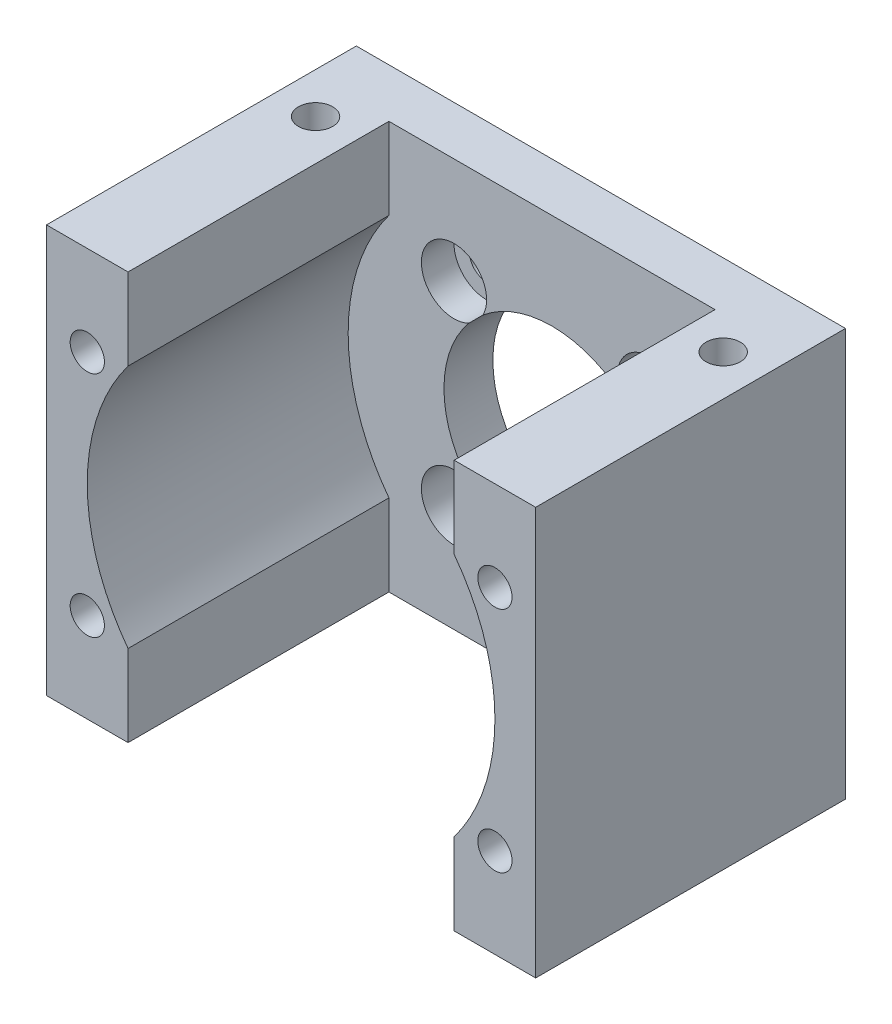
ISO-10303-21;
HEADER;
FILE_DESCRIPTION(('STEP AP214'),'2;1');
FILE_NAME('part.step','',(''),(''),'','','');
FILE_SCHEMA(('AUTOMOTIVE_DESIGN { 1 0 10303 214 1 1 1 1 }'));
ENDSEC;
DATA;
#1=APPLICATION_CONTEXT('core data for automotive mechanical design processes');
#2=APPLICATION_PROTOCOL_DEFINITION('international standard','automotive_design',2000,#1);
#3=PRODUCT_CONTEXT('',#1,'mechanical');
#4=PRODUCT('Part','Part','',(#3));
#5=PRODUCT_RELATED_PRODUCT_CATEGORY('part','',(#4));
#6=PRODUCT_DEFINITION_FORMATION('','',#4);
#7=PRODUCT_DEFINITION_CONTEXT('part definition',#1,'design');
#8=PRODUCT_DEFINITION('design','',#6,#7);
#9=PRODUCT_DEFINITION_SHAPE('','',#8);
#10=(LENGTH_UNIT() NAMED_UNIT(*) SI_UNIT(.MILLI.,.METRE.));
#11=(NAMED_UNIT(*) PLANE_ANGLE_UNIT() SI_UNIT($,.RADIAN.));
#12=(NAMED_UNIT(*) SI_UNIT($,.STERADIAN.) SOLID_ANGLE_UNIT());
#13=UNCERTAINTY_MEASURE_WITH_UNIT(LENGTH_MEASURE(1.E-05),#10,'distance_accuracy_value','');
#14=(GEOMETRIC_REPRESENTATION_CONTEXT(3) GLOBAL_UNCERTAINTY_ASSIGNED_CONTEXT((#13)) GLOBAL_UNIT_ASSIGNED_CONTEXT((#10,
#11,#12)) REPRESENTATION_CONTEXT('',''));
#15=CARTESIAN_POINT('',(0.,0.,0.));
#16=DIRECTION('',(0.,0.,1.));
#17=DIRECTION('',(1.,0.,0.));
#18=AXIS2_PLACEMENT_3D('',#15,#16,#17);
#19=CARTESIAN_POINT('',(-12.0208152801712,12.0208152801714,6.));
#20=DIRECTION('',(0.,0.,1.));
#21=DIRECTION('',(1.,0.,0.));
#22=AXIS2_PLACEMENT_3D('',#19,#20,#21);
#23=CYLINDRICAL_SURFACE('',#22,2.09999999999999);
#24=CARTESIAN_POINT('',(-12.0208152801712,12.0208152801714,0.));
#25=DIRECTION('',(0.,0.,1.));
#26=DIRECTION('',(1.,0.,0.));
#27=AXIS2_PLACEMENT_3D('',#24,#25,#26);
#28=CIRCLE('',#27,2.1);
#29=CARTESIAN_POINT('',(-9.92081528017118,12.0208152801714,0.));
#30=VERTEX_POINT('',#29);
#31=EDGE_CURVE('E333',#30,#30,#28,.T.);
#32=ORIENTED_EDGE('',*,*,#31,.F.);
#33=EDGE_LOOP('',(#32));
#34=FACE_BOUND('',#33,.T.);
#35=CARTESIAN_POINT('',(-12.0208152801712,12.0208152801714,2.));
#36=DIRECTION('',(0.,0.,1.));
#37=DIRECTION('',(1.,0.,0.));
#38=AXIS2_PLACEMENT_3D('',#35,#36,#37);
#39=CIRCLE('',#38,2.09999999999999);
#40=CARTESIAN_POINT('',(-9.92081528017119,12.0208152801714,2.));
#41=VERTEX_POINT('',#40);
#42=EDGE_CURVE('E263',#41,#41,#39,.F.);
#43=ORIENTED_EDGE('',*,*,#42,.F.);
#44=EDGE_LOOP('',(#43));
#45=FACE_BOUND('',#44,.T.);
#46=ADVANCED_FACE('F41',(#34,#45),#23,.F.);
#47=CARTESIAN_POINT('',(-12.0208152801713,-12.0208152801713,6.));
#48=DIRECTION('',(0.,0.,1.));
#49=DIRECTION('',(1.,0.,0.));
#50=AXIS2_PLACEMENT_3D('',#47,#48,#49);
#51=CYLINDRICAL_SURFACE('',#50,2.09999999999999);
#52=CARTESIAN_POINT('',(-12.0208152801713,-12.0208152801713,0.));
#53=DIRECTION('',(0.,0.,1.));
#54=DIRECTION('',(1.,0.,0.));
#55=AXIS2_PLACEMENT_3D('',#52,#53,#54);
#56=CIRCLE('',#55,2.1);
#57=CARTESIAN_POINT('',(-9.92081528017131,-12.0208152801713,0.));
#58=VERTEX_POINT('',#57);
#59=EDGE_CURVE('E336',#58,#58,#56,.T.);
#60=ORIENTED_EDGE('',*,*,#59,.F.);
#61=EDGE_LOOP('',(#60));
#62=FACE_BOUND('',#61,.T.);
#63=CARTESIAN_POINT('',(-12.0208152801713,-12.0208152801713,2.));
#64=DIRECTION('',(0.,0.,1.));
#65=DIRECTION('',(1.,0.,0.));
#66=AXIS2_PLACEMENT_3D('',#63,#64,#65);
#67=CIRCLE('',#66,2.09999999999999);
#68=CARTESIAN_POINT('',(-9.92081528017132,-12.0208152801713,2.));
#69=VERTEX_POINT('',#68);
#70=EDGE_CURVE('E256',#69,#69,#67,.F.);
#71=ORIENTED_EDGE('',*,*,#70,.F.);
#72=EDGE_LOOP('',(#71));
#73=FACE_BOUND('',#72,.T.);
#74=ADVANCED_FACE('F486',(#62,#73),#51,.F.);
#75=CARTESIAN_POINT('',(12.0208152801713,-12.0208152801713,6.));
#76=DIRECTION('',(0.,0.,1.));
#77=DIRECTION('',(1.,0.,0.));
#78=AXIS2_PLACEMENT_3D('',#75,#76,#77);
#79=CYLINDRICAL_SURFACE('',#78,2.09999999999999);
#80=CARTESIAN_POINT('',(12.0208152801713,-12.0208152801713,0.));
#81=DIRECTION('',(0.,0.,1.));
#82=DIRECTION('',(1.,0.,0.));
#83=AXIS2_PLACEMENT_3D('',#80,#81,#82);
#84=CIRCLE('',#83,2.1);
#85=CARTESIAN_POINT('',(14.1208152801713,-12.0208152801713,0.));
#86=VERTEX_POINT('',#85);
#87=EDGE_CURVE('E339',#86,#86,#84,.T.);
#88=ORIENTED_EDGE('',*,*,#87,.F.);
#89=EDGE_LOOP('',(#88));
#90=FACE_BOUND('',#89,.T.);
#91=CARTESIAN_POINT('',(12.0208152801713,-12.0208152801713,2.));
#92=DIRECTION('',(0.,0.,1.));
#93=DIRECTION('',(1.,0.,0.));
#94=AXIS2_PLACEMENT_3D('',#91,#92,#93);
#95=CIRCLE('',#94,2.09999999999999);
#96=CARTESIAN_POINT('',(14.1208152801712,-12.0208152801713,2.));
#97=VERTEX_POINT('',#96);
#98=EDGE_CURVE('E245',#97,#97,#95,.F.);
#99=ORIENTED_EDGE('',*,*,#98,.F.);
#100=EDGE_LOOP('',(#99));
#101=FACE_BOUND('',#100,.T.);
#102=ADVANCED_FACE('F492',(#90,#101),#79,.F.);
#103=CARTESIAN_POINT('',(12.0208152801713,12.0208152801713,6.));
#104=DIRECTION('',(0.,0.,1.));
#105=DIRECTION('',(1.,0.,0.));
#106=AXIS2_PLACEMENT_3D('',#103,#104,#105);
#107=CYLINDRICAL_SURFACE('',#106,2.09999999999999);
#108=CARTESIAN_POINT('',(12.0208152801713,12.0208152801713,0.));
#109=DIRECTION('',(0.,0.,1.));
#110=DIRECTION('',(1.,0.,0.));
#111=AXIS2_PLACEMENT_3D('',#108,#109,#110);
#112=CIRCLE('',#111,2.1);
#113=CARTESIAN_POINT('',(14.1208152801713,12.0208152801713,0.));
#114=VERTEX_POINT('',#113);
#115=EDGE_CURVE('E330',#114,#114,#112,.T.);
#116=ORIENTED_EDGE('',*,*,#115,.F.);
#117=EDGE_LOOP('',(#116));
#118=FACE_BOUND('',#117,.T.);
#119=CARTESIAN_POINT('',(12.0208152801713,12.0208152801713,2.));
#120=DIRECTION('',(0.,0.,1.));
#121=DIRECTION('',(1.,0.,0.));
#122=AXIS2_PLACEMENT_3D('',#119,#120,#121);
#123=CIRCLE('',#122,2.09999999999999);
#124=CARTESIAN_POINT('',(14.1208152801713,12.0208152801713,2.));
#125=VERTEX_POINT('',#124);
#126=EDGE_CURVE('E233',#125,#125,#123,.F.);
#127=ORIENTED_EDGE('',*,*,#126,.F.);
#128=EDGE_LOOP('',(#127));
#129=FACE_BOUND('',#128,.T.);
#130=ADVANCED_FACE('F498',(#118,#129),#107,.F.);
#131=CARTESIAN_POINT('',(20.,-25.,6.));
#132=DIRECTION('',(1.,0.,0.));
#133=DIRECTION('',(0.,0.,-1.));
#134=AXIS2_PLACEMENT_3D('',#131,#132,#133);
#135=PLANE('',#134);
#136=DIRECTION('',(0.,1.,0.));
#137=VECTOR('',#136,1.);
#138=CARTESIAN_POINT('',(20.,-25.,6.));
#139=LINE('',#138,#137);
#140=CARTESIAN_POINT('',(20.,15.,5.99999999999999));
#141=VERTEX_POINT('',#140);
#142=CARTESIAN_POINT('',(20.,25.,6.));
#143=VERTEX_POINT('',#142);
#144=EDGE_CURVE('E372',#141,#143,#139,.T.);
#145=ORIENTED_EDGE('',*,*,#144,.F.);
#146=DIRECTION('',(0.,0.,1.));
#147=VECTOR('',#146,1.);
#148=CARTESIAN_POINT('',(20.,15.,-64.7106781186548));
#149=LINE('',#148,#147);
#150=CARTESIAN_POINT('',(20.,15.,38.));
#151=VERTEX_POINT('',#150);
#152=EDGE_CURVE('E359',#141,#151,#149,.T.);
#153=ORIENTED_EDGE('',*,*,#152,.T.);
#154=DIRECTION('',(0.,1.,0.));
#155=VECTOR('',#154,1.);
#156=CARTESIAN_POINT('',(20.,0.,38.));
#157=LINE('',#156,#155);
#158=CARTESIAN_POINT('',(20.,25.,38.));
#159=VERTEX_POINT('',#158);
#160=EDGE_CURVE('E421',#151,#159,#157,.T.);
#161=ORIENTED_EDGE('',*,*,#160,.T.);
#162=DIRECTION('',(0.,0.,-1.));
#163=VECTOR('',#162,1.);
#164=CARTESIAN_POINT('',(20.,25.,6.));
#165=LINE('',#164,#163);
#166=EDGE_CURVE('E362',#159,#143,#165,.T.);
#167=ORIENTED_EDGE('',*,*,#166,.T.);
#168=EDGE_LOOP('',(#145,#153,#161,#167));
#169=FACE_BOUND('',#168,.T.);
#170=ADVANCED_FACE('F473',(#169),#135,.F.);
#171=CARTESIAN_POINT('',(-20.,-25.,5.99999999999999));
#172=DIRECTION('',(-1.,0.,0.));
#173=DIRECTION('',(0.,0.,1.));
#174=AXIS2_PLACEMENT_3D('',#171,#172,#173);
#175=PLANE('',#174);
#176=DIRECTION('',(0.,1.,0.));
#177=VECTOR('',#176,1.);
#178=CARTESIAN_POINT('',(-20.,-25.,5.99999999999999));
#179=LINE('',#178,#177);
#180=CARTESIAN_POINT('',(-20.,-25.,5.99999999999999));
#181=VERTEX_POINT('',#180);
#182=CARTESIAN_POINT('',(-20.,-15.,5.99999999999999));
#183=VERTEX_POINT('',#182);
#184=EDGE_CURVE('E378',#181,#183,#179,.T.);
#185=ORIENTED_EDGE('',*,*,#184,.T.);
#186=DIRECTION('',(0.,0.,1.));
#187=VECTOR('',#186,1.);
#188=CARTESIAN_POINT('',(-20.,-15.,-64.7106781186548));
#189=LINE('',#188,#187);
#190=CARTESIAN_POINT('',(-20.,-15.,38.));
#191=VERTEX_POINT('',#190);
#192=EDGE_CURVE('E353',#183,#191,#189,.T.);
#193=ORIENTED_EDGE('',*,*,#192,.T.);
#194=DIRECTION('',(0.,-1.,0.));
#195=VECTOR('',#194,1.);
#196=CARTESIAN_POINT('',(-20.,0.,38.));
#197=LINE('',#196,#195);
#198=CARTESIAN_POINT('',(-20.,-25.,38.));
#199=VERTEX_POINT('',#198);
#200=EDGE_CURVE('E418',#191,#199,#197,.T.);
#201=ORIENTED_EDGE('',*,*,#200,.T.);
#202=DIRECTION('',(0.,0.,1.));
#203=VECTOR('',#202,1.);
#204=CARTESIAN_POINT('',(-20.,-25.,5.99999999999999));
#205=LINE('',#204,#203);
#206=EDGE_CURVE('E369',#181,#199,#205,.T.);
#207=ORIENTED_EDGE('',*,*,#206,.F.);
#208=EDGE_LOOP('',(#185,#193,#201,#207));
#209=FACE_BOUND('',#208,.T.);
#210=ADVANCED_FACE('F427',(#209),#175,.F.);
#211=CARTESIAN_POINT('',(0.,0.,38.));
#212=DIRECTION('',(0.,0.,1.));
#213=DIRECTION('',(1.,0.,0.));
#214=AXIS2_PLACEMENT_3D('',#211,#212,#213);
#215=PLANE('',#214);
#216=CARTESIAN_POINT('',(25.,-14.,38.));
#217=DIRECTION('',(0.,0.,1.));
#218=DIRECTION('',(1.,0.,0.));
#219=AXIS2_PLACEMENT_3D('',#216,#217,#218);
#220=CIRCLE('',#219,2.09999999999999);
#221=CARTESIAN_POINT('',(27.1,-14.,38.));
#222=VERTEX_POINT('',#221);
#223=EDGE_CURVE('E318',#222,#222,#220,.T.);
#224=ORIENTED_EDGE('',*,*,#223,.F.);
#225=EDGE_LOOP('',(#224));
#226=FACE_BOUND('',#225,.T.);
#227=CARTESIAN_POINT('',(25.,14.,38.));
#228=DIRECTION('',(0.,0.,1.));
#229=DIRECTION('',(1.,0.,0.));
#230=AXIS2_PLACEMENT_3D('',#227,#228,#229);
#231=CIRCLE('',#230,2.09999999999999);
#232=CARTESIAN_POINT('',(27.1,14.,38.));
#233=VERTEX_POINT('',#232);
#234=EDGE_CURVE('E324',#233,#233,#231,.T.);
#235=ORIENTED_EDGE('',*,*,#234,.F.);
#236=EDGE_LOOP('',(#235));
#237=FACE_BOUND('',#236,.T.);
#238=CARTESIAN_POINT('',(0.,0.,38.));
#239=DIRECTION('',(0.,0.,1.));
#240=DIRECTION('',(1.,0.,0.));
#241=AXIS2_PLACEMENT_3D('',#238,#239,#240);
#242=CIRCLE('',#241,25.);
#243=CARTESIAN_POINT('',(20.,-15.,38.));
#244=VERTEX_POINT('',#243);
#245=EDGE_CURVE('E230',#244,#151,#242,.T.);
#246=ORIENTED_EDGE('',*,*,#245,.F.);
#247=CARTESIAN_POINT('',(20.,-25.,38.));
#248=VERTEX_POINT('',#247);
#249=EDGE_CURVE('E231',#248,#244,#157,.T.);
#250=ORIENTED_EDGE('',*,*,#249,.F.);
#251=DIRECTION('',(1.,0.,0.));
#252=VECTOR('',#251,1.);
#253=CARTESIAN_POINT('',(-30.,-25.,38.));
#254=LINE('',#253,#252);
#255=CARTESIAN_POINT('',(30.,-25.,38.));
#256=VERTEX_POINT('',#255);
#257=EDGE_CURVE('E396',#248,#256,#254,.T.);
#258=ORIENTED_EDGE('',*,*,#257,.T.);
#259=DIRECTION('',(0.,1.,0.));
#260=VECTOR('',#259,1.);
#261=CARTESIAN_POINT('',(30.,25.,38.));
#262=LINE('',#261,#260);
#263=CARTESIAN_POINT('',(30.,25.,38.));
#264=VERTEX_POINT('',#263);
#265=EDGE_CURVE('E386',#256,#264,#262,.T.);
#266=ORIENTED_EDGE('',*,*,#265,.T.);
#267=DIRECTION('',(-1.,0.,0.));
#268=VECTOR('',#267,1.);
#269=CARTESIAN_POINT('',(-30.,25.,38.));
#270=LINE('',#269,#268);
#271=EDGE_CURVE('E391',#264,#159,#270,.T.);
#272=ORIENTED_EDGE('',*,*,#271,.T.);
#273=ORIENTED_EDGE('',*,*,#160,.F.);
#274=EDGE_LOOP('',(#246,#250,#258,#266,#272,#273));
#275=FACE_BOUND('',#274,.T.);
#276=ADVANCED_FACE('F455',(#226,#237,#275),#215,.T.);
#277=CARTESIAN_POINT('',(30.,25.,38.));
#278=DIRECTION('',(-1.,0.,0.));
#279=DIRECTION('',(0.,-1.,0.));
#280=AXIS2_PLACEMENT_3D('',#277,#278,#279);
#281=PLANE('',#280);
#282=DIRECTION('',(0.,1.,0.));
#283=VECTOR('',#282,1.);
#284=CARTESIAN_POINT('',(30.,25.,0.));
#285=LINE('',#284,#283);
#286=CARTESIAN_POINT('',(30.,-25.,0.));
#287=VERTEX_POINT('',#286);
#288=CARTESIAN_POINT('',(30.,25.,0.));
#289=VERTEX_POINT('',#288);
#290=EDGE_CURVE('E381',#287,#289,#285,.T.);
#291=ORIENTED_EDGE('',*,*,#290,.T.);
#292=DIRECTION('',(0.,0.,-1.));
#293=VECTOR('',#292,1.);
#294=CARTESIAN_POINT('',(30.,25.,38.));
#295=LINE('',#294,#293);
#296=EDGE_CURVE('E416',#264,#289,#295,.T.);
#297=ORIENTED_EDGE('',*,*,#296,.F.);
#298=ORIENTED_EDGE('',*,*,#265,.F.);
#299=DIRECTION('',(0.,0.,-1.));
#300=VECTOR('',#299,1.);
#301=CARTESIAN_POINT('',(30.,-25.,38.));
#302=LINE('',#301,#300);
#303=EDGE_CURVE('E400',#256,#287,#302,.T.);
#304=ORIENTED_EDGE('',*,*,#303,.T.);
#305=EDGE_LOOP('',(#291,#297,#298,#304));
#306=FACE_BOUND('',#305,.T.);
#307=ADVANCED_FACE('F43',(#306),#281,.F.);
#308=CARTESIAN_POINT('',(-30.,25.,38.));
#309=DIRECTION('',(0.,-1.,0.));
#310=DIRECTION('',(0.,0.,-1.));
#311=AXIS2_PLACEMENT_3D('',#308,#309,#310);
#312=PLANE('',#311);
#313=CARTESIAN_POINT('',(-25.,25.,10.));
#314=DIRECTION('',(0.,1.,0.));
#315=DIRECTION('',(0.,0.,1.));
#316=AXIS2_PLACEMENT_3D('',#313,#314,#315);
#317=CIRCLE('',#316,2.1);
#318=CARTESIAN_POINT('',(-25.,25.,12.1));
#319=VERTEX_POINT('',#318);
#320=EDGE_CURVE('E294',#319,#319,#317,.T.);
#321=ORIENTED_EDGE('',*,*,#320,.F.);
#322=EDGE_LOOP('',(#321));
#323=FACE_BOUND('',#322,.T.);
#324=CARTESIAN_POINT('',(25.,25.,10.));
#325=DIRECTION('',(0.,1.,0.));
#326=DIRECTION('',(0.,0.,1.));
#327=AXIS2_PLACEMENT_3D('',#324,#325,#326);
#328=CIRCLE('',#327,2.1);
#329=CARTESIAN_POINT('',(25.,25.,12.1));
#330=VERTEX_POINT('',#329);
#331=EDGE_CURVE('E300',#330,#330,#328,.T.);
#332=ORIENTED_EDGE('',*,*,#331,.F.);
#333=EDGE_LOOP('',(#332));
#334=FACE_BOUND('',#333,.T.);
#335=DIRECTION('',(-1.,0.,0.));
#336=VECTOR('',#335,1.);
#337=CARTESIAN_POINT('',(-20.,25.,5.99999999999999));
#338=LINE('',#337,#336);
#339=CARTESIAN_POINT('',(-20.,25.,5.99999999999999));
#340=VERTEX_POINT('',#339);
#341=EDGE_CURVE('E375',#143,#340,#338,.T.);
#342=ORIENTED_EDGE('',*,*,#341,.F.);
#343=ORIENTED_EDGE('',*,*,#166,.F.);
#344=ORIENTED_EDGE('',*,*,#271,.F.);
#345=ORIENTED_EDGE('',*,*,#296,.T.);
#346=DIRECTION('',(-1.,0.,0.));
#347=VECTOR('',#346,1.);
#348=CARTESIAN_POINT('',(-30.,25.,0.));
#349=LINE('',#348,#347);
#350=CARTESIAN_POINT('',(-30.,25.,0.));
#351=VERTEX_POINT('',#350);
#352=EDGE_CURVE('E403',#289,#351,#349,.T.);
#353=ORIENTED_EDGE('',*,*,#352,.T.);
#354=DIRECTION('',(0.,0.,-1.));
#355=VECTOR('',#354,1.);
#356=CARTESIAN_POINT('',(-30.,25.,38.));
#357=LINE('',#356,#355);
#358=CARTESIAN_POINT('',(-30.,25.,38.));
#359=VERTEX_POINT('',#358);
#360=EDGE_CURVE('E413',#359,#351,#357,.T.);
#361=ORIENTED_EDGE('',*,*,#360,.F.);
#362=CARTESIAN_POINT('',(-20.,25.,38.));
#363=VERTEX_POINT('',#362);
#364=EDGE_CURVE('E389',#363,#359,#270,.T.);
#365=ORIENTED_EDGE('',*,*,#364,.F.);
#366=DIRECTION('',(0.,0.,1.));
#367=VECTOR('',#366,1.);
#368=CARTESIAN_POINT('',(-20.,25.,5.99999999999999));
#369=LINE('',#368,#367);
#370=EDGE_CURVE('E367',#340,#363,#369,.T.);
#371=ORIENTED_EDGE('',*,*,#370,.F.);
#372=EDGE_LOOP('',(#342,#343,#344,#345,#353,#361,#365,#371));
#373=FACE_BOUND('',#372,.T.);
#374=ADVANCED_FACE('F469',(#323,#334,#373),#312,.F.);
#375=CARTESIAN_POINT('',(-30.,25.,38.));
#376=DIRECTION('',(1.,0.,0.));
#377=DIRECTION('',(0.,1.,0.));
#378=AXIS2_PLACEMENT_3D('',#375,#376,#377);
#379=PLANE('',#378);
#380=DIRECTION('',(0.,-1.,0.));
#381=VECTOR('',#380,1.);
#382=CARTESIAN_POINT('',(-30.,25.,0.));
#383=LINE('',#382,#381);
#384=CARTESIAN_POINT('',(-30.,-25.,0.));
#385=VERTEX_POINT('',#384);
#386=EDGE_CURVE('E405',#351,#385,#383,.T.);
#387=ORIENTED_EDGE('',*,*,#386,.T.);
#388=DIRECTION('',(0.,0.,-1.));
#389=VECTOR('',#388,1.);
#390=CARTESIAN_POINT('',(-30.,-25.,38.));
#391=LINE('',#390,#389);
#392=CARTESIAN_POINT('',(-30.,-25.,38.));
#393=VERTEX_POINT('',#392);
#394=EDGE_CURVE('E410',#393,#385,#391,.T.);
#395=ORIENTED_EDGE('',*,*,#394,.F.);
#396=DIRECTION('',(0.,-1.,0.));
#397=VECTOR('',#396,1.);
#398=CARTESIAN_POINT('',(-30.,25.,38.));
#399=LINE('',#398,#397);
#400=EDGE_CURVE('E394',#359,#393,#399,.T.);
#401=ORIENTED_EDGE('',*,*,#400,.F.);
#402=ORIENTED_EDGE('',*,*,#360,.T.);
#403=EDGE_LOOP('',(#387,#395,#401,#402));
#404=FACE_BOUND('',#403,.T.);
#405=ADVANCED_FACE('F442',(#404),#379,.F.);
#406=CARTESIAN_POINT('',(-30.,-25.,38.));
#407=DIRECTION('',(0.,1.,0.));
#408=DIRECTION('',(0.,0.,1.));
#409=AXIS2_PLACEMENT_3D('',#406,#407,#408);
#410=PLANE('',#409);
#411=CARTESIAN_POINT('',(-25.,-25.,10.));
#412=DIRECTION('',(0.,-1.,0.));
#413=DIRECTION('',(0.,0.,-1.));
#414=AXIS2_PLACEMENT_3D('',#411,#412,#413);
#415=CIRCLE('',#414,2.1);
#416=CARTESIAN_POINT('',(-25.,-25.,7.9));
#417=VERTEX_POINT('',#416);
#418=EDGE_CURVE('E282',#417,#417,#415,.T.);
#419=ORIENTED_EDGE('',*,*,#418,.F.);
#420=EDGE_LOOP('',(#419));
#421=FACE_BOUND('',#420,.T.);
#422=CARTESIAN_POINT('',(25.,-25.,10.));
#423=DIRECTION('',(0.,-1.,0.));
#424=DIRECTION('',(0.,0.,-1.));
#425=AXIS2_PLACEMENT_3D('',#422,#423,#424);
#426=CIRCLE('',#425,2.1);
#427=CARTESIAN_POINT('',(25.,-25.,7.9));
#428=VERTEX_POINT('',#427);
#429=EDGE_CURVE('E288',#428,#428,#426,.T.);
#430=ORIENTED_EDGE('',*,*,#429,.F.);
#431=EDGE_LOOP('',(#430));
#432=FACE_BOUND('',#431,.T.);
#433=ORIENTED_EDGE('',*,*,#257,.F.);
#434=DIRECTION('',(0.,0.,-1.));
#435=VECTOR('',#434,1.);
#436=CARTESIAN_POINT('',(20.,-25.,6.));
#437=LINE('',#436,#435);
#438=CARTESIAN_POINT('',(20.,-25.,6.));
#439=VERTEX_POINT('',#438);
#440=EDGE_CURVE('E363',#248,#439,#437,.T.);
#441=ORIENTED_EDGE('',*,*,#440,.T.);
#442=DIRECTION('',(-1.,0.,0.));
#443=VECTOR('',#442,1.);
#444=CARTESIAN_POINT('',(-20.,-25.,5.99999999999999));
#445=LINE('',#444,#443);
#446=EDGE_CURVE('E366',#439,#181,#445,.T.);
#447=ORIENTED_EDGE('',*,*,#446,.T.);
#448=ORIENTED_EDGE('',*,*,#206,.T.);
#449=EDGE_CURVE('E397',#393,#199,#254,.T.);
#450=ORIENTED_EDGE('',*,*,#449,.F.);
#451=ORIENTED_EDGE('',*,*,#394,.T.);
#452=DIRECTION('',(1.,0.,0.));
#453=VECTOR('',#452,1.);
#454=CARTESIAN_POINT('',(-30.,-25.,0.));
#455=LINE('',#454,#453);
#456=EDGE_CURVE('E390',#385,#287,#455,.T.);
#457=ORIENTED_EDGE('',*,*,#456,.T.);
#458=ORIENTED_EDGE('',*,*,#303,.F.);
#459=EDGE_LOOP('',(#433,#441,#447,#448,#450,#451,#457,#458));
#460=FACE_BOUND('',#459,.T.);
#461=ADVANCED_FACE('F433',(#421,#432,#460),#410,.F.);
#462=CARTESIAN_POINT('',(-25.,14.,38.));
#463=DIRECTION('',(0.,0.,1.));
#464=DIRECTION('',(1.,0.,0.));
#465=AXIS2_PLACEMENT_3D('',#462,#463,#464);
#466=CIRCLE('',#465,2.09999999999999);
#467=CARTESIAN_POINT('',(-22.9,14.,38.));
#468=VERTEX_POINT('',#467);
#469=EDGE_CURVE('E306',#468,#468,#466,.T.);
#470=ORIENTED_EDGE('',*,*,#469,.F.);
#471=EDGE_LOOP('',(#470));
#472=FACE_BOUND('',#471,.T.);
#473=CARTESIAN_POINT('',(-25.,-14.,38.));
#474=DIRECTION('',(0.,0.,1.));
#475=DIRECTION('',(1.,0.,0.));
#476=AXIS2_PLACEMENT_3D('',#473,#474,#475);
#477=CIRCLE('',#476,2.09999999999999);
#478=CARTESIAN_POINT('',(-22.9,-14.,38.));
#479=VERTEX_POINT('',#478);
#480=EDGE_CURVE('E312',#479,#479,#477,.T.);
#481=ORIENTED_EDGE('',*,*,#480,.F.);
#482=EDGE_LOOP('',(#481));
#483=FACE_BOUND('',#482,.T.);
#484=CARTESIAN_POINT('',(-20.,15.,38.));
#485=VERTEX_POINT('',#484);
#486=EDGE_CURVE('E345',#485,#191,#242,.T.);
#487=ORIENTED_EDGE('',*,*,#486,.F.);
#488=EDGE_CURVE('E419',#363,#485,#197,.T.);
#489=ORIENTED_EDGE('',*,*,#488,.F.);
#490=ORIENTED_EDGE('',*,*,#364,.T.);
#491=ORIENTED_EDGE('',*,*,#400,.T.);
#492=ORIENTED_EDGE('',*,*,#449,.T.);
#493=ORIENTED_EDGE('',*,*,#200,.F.);
#494=EDGE_LOOP('',(#487,#489,#490,#491,#492,#493));
#495=FACE_BOUND('',#494,.T.);
#496=ADVANCED_FACE('F436',(#472,#483,#495),#215,.T.);
#497=CARTESIAN_POINT('',(0.,0.,0.));
#498=DIRECTION('',(0.,0.,1.));
#499=DIRECTION('',(1.,0.,0.));
#500=AXIS2_PLACEMENT_3D('',#497,#498,#499);
#501=PLANE('',#500);
#502=ORIENTED_EDGE('',*,*,#115,.T.);
#503=EDGE_LOOP('',(#502));
#504=FACE_BOUND('',#503,.T.);
#505=ORIENTED_EDGE('',*,*,#31,.T.);
#506=EDGE_LOOP('',(#505));
#507=FACE_BOUND('',#506,.T.);
#508=ORIENTED_EDGE('',*,*,#59,.T.);
#509=EDGE_LOOP('',(#508));
#510=FACE_BOUND('',#509,.T.);
#511=ORIENTED_EDGE('',*,*,#87,.T.);
#512=EDGE_LOOP('',(#511));
#513=FACE_BOUND('',#512,.T.);
#514=CARTESIAN_POINT('',(0.,0.,0.));
#515=DIRECTION('',(0.,0.,-1.));
#516=DIRECTION('',(-1.,0.,0.));
#517=AXIS2_PLACEMENT_3D('',#514,#515,#516);
#518=CIRCLE('',#517,13.25);
#519=CARTESIAN_POINT('',(-13.25,0.,0.));
#520=VERTEX_POINT('',#519);
#521=EDGE_CURVE('E226',#520,#520,#518,.T.);
#522=ORIENTED_EDGE('',*,*,#521,.F.);
#523=EDGE_LOOP('',(#522));
#524=FACE_BOUND('',#523,.T.);
#525=ORIENTED_EDGE('',*,*,#290,.F.);
#526=ORIENTED_EDGE('',*,*,#456,.F.);
#527=ORIENTED_EDGE('',*,*,#386,.F.);
#528=ORIENTED_EDGE('',*,*,#352,.F.);
#529=EDGE_LOOP('',(#525,#526,#527,#528));
#530=FACE_BOUND('',#529,.T.);
#531=ADVANCED_FACE('F448',(#504,#507,#510,#513,#524,#530),#501,.F.);
#532=ORIENTED_EDGE('',*,*,#249,.T.);
#533=DIRECTION('',(0.,0.,1.));
#534=VECTOR('',#533,1.);
#535=CARTESIAN_POINT('',(20.,-15.,-64.7106781186548));
#536=LINE('',#535,#534);
#537=CARTESIAN_POINT('',(20.,-15.,5.99999999999999));
#538=VERTEX_POINT('',#537);
#539=EDGE_CURVE('E356',#244,#538,#536,.F.);
#540=ORIENTED_EDGE('',*,*,#539,.T.);
#541=EDGE_CURVE('E383',#439,#538,#139,.T.);
#542=ORIENTED_EDGE('',*,*,#541,.F.);
#543=ORIENTED_EDGE('',*,*,#440,.F.);
#544=EDGE_LOOP('',(#532,#540,#542,#543));
#545=FACE_BOUND('',#544,.T.);
#546=ADVANCED_FACE('F459',(#545),#135,.F.);
#547=ORIENTED_EDGE('',*,*,#488,.T.);
#548=DIRECTION('',(0.,0.,1.));
#549=VECTOR('',#548,1.);
#550=CARTESIAN_POINT('',(-20.,15.,-64.7106781186548));
#551=LINE('',#550,#549);
#552=CARTESIAN_POINT('',(-20.,15.,5.99999999999999));
#553=VERTEX_POINT('',#552);
#554=EDGE_CURVE('E350',#485,#553,#551,.F.);
#555=ORIENTED_EDGE('',*,*,#554,.T.);
#556=EDGE_CURVE('E382',#553,#340,#179,.T.);
#557=ORIENTED_EDGE('',*,*,#556,.T.);
#558=ORIENTED_EDGE('',*,*,#370,.T.);
#559=EDGE_LOOP('',(#547,#555,#557,#558));
#560=FACE_BOUND('',#559,.T.);
#561=ADVANCED_FACE('F465',(#560),#175,.F.);
#562=CARTESIAN_POINT('',(-20.,-25.,5.99999999999999));
#563=DIRECTION('',(0.,0.,-1.));
#564=DIRECTION('',(-1.,0.,0.));
#565=AXIS2_PLACEMENT_3D('',#562,#563,#564);
#566=PLANE('',#565);
#567=CARTESIAN_POINT('',(0.,0.,6.));
#568=DIRECTION('',(0.,0.,-1.));
#569=DIRECTION('',(-1.,0.,0.));
#570=AXIS2_PLACEMENT_3D('',#567,#568,#569);
#571=CIRCLE('',#570,13.25);
#572=CARTESIAN_POINT('',(-10.1968744745556,-8.46086585109089,6.));
#573=VERTEX_POINT('',#572);
#574=CARTESIAN_POINT('',(-10.1968744745555,8.460865851091,6.));
#575=VERTEX_POINT('',#574);
#576=EDGE_CURVE('E214',#573,#575,#571,.T.);
#577=ORIENTED_EDGE('',*,*,#576,.T.);
#578=CARTESIAN_POINT('',(-12.0208152801712,12.0208152801714,6.));
#579=DIRECTION('',(0.,0.,1.));
#580=DIRECTION('',(0.,1.,0.));
#581=AXIS2_PLACEMENT_3D('',#578,#579,#580);
#582=CIRCLE('',#581,4.);
#583=CARTESIAN_POINT('',(-8.46086585109079,10.1968744745557,6.));
#584=VERTEX_POINT('',#583);
#585=EDGE_CURVE('E201',#584,#575,#582,.T.);
#586=ORIENTED_EDGE('',*,*,#585,.F.);
#587=CARTESIAN_POINT('',(8.46086585109089,10.1968744745556,6.));
#588=VERTEX_POINT('',#587);
#589=EDGE_CURVE('E223',#584,#588,#571,.T.);
#590=ORIENTED_EDGE('',*,*,#589,.T.);
#591=CARTESIAN_POINT('',(12.0208152801713,12.0208152801713,6.));
#592=DIRECTION('',(0.,0.,1.));
#593=DIRECTION('',(1.,0.,0.));
#594=AXIS2_PLACEMENT_3D('',#591,#592,#593);
#595=CIRCLE('',#594,4.);
#596=CARTESIAN_POINT('',(10.1968744745556,8.46086585109089,6.));
#597=VERTEX_POINT('',#596);
#598=EDGE_CURVE('E277',#597,#588,#595,.T.);
#599=ORIENTED_EDGE('',*,*,#598,.F.);
#600=CARTESIAN_POINT('',(10.1968744745556,-8.46086585109092,6.));
#601=VERTEX_POINT('',#600);
#602=EDGE_CURVE('E225',#597,#601,#571,.T.);
#603=ORIENTED_EDGE('',*,*,#602,.T.);
#604=CARTESIAN_POINT('',(12.0208152801713,-12.0208152801713,6.));
#605=DIRECTION('',(0.,0.,1.));
#606=DIRECTION('',(0.,-1.,0.));
#607=AXIS2_PLACEMENT_3D('',#604,#605,#606);
#608=CIRCLE('',#607,4.);
#609=CARTESIAN_POINT('',(8.46086585109086,-10.1968744745557,6.));
#610=VERTEX_POINT('',#609);
#611=EDGE_CURVE('E273',#610,#601,#608,.T.);
#612=ORIENTED_EDGE('',*,*,#611,.F.);
#613=CARTESIAN_POINT('',(-8.46086585109089,-10.1968744745556,6.));
#614=VERTEX_POINT('',#613);
#615=EDGE_CURVE('E222',#610,#614,#571,.T.);
#616=ORIENTED_EDGE('',*,*,#615,.T.);
#617=CARTESIAN_POINT('',(-12.0208152801713,-12.0208152801713,6.));
#618=DIRECTION('',(0.,0.,1.));
#619=DIRECTION('',(-1.,0.,0.));
#620=AXIS2_PLACEMENT_3D('',#617,#618,#619);
#621=CIRCLE('',#620,4.);
#622=EDGE_CURVE('E221',#573,#614,#621,.T.);
#623=ORIENTED_EDGE('',*,*,#622,.F.);
#624=EDGE_LOOP('',(#577,#586,#590,#599,#603,#612,#616,#623));
#625=FACE_BOUND('',#624,.T.);
#626=ORIENTED_EDGE('',*,*,#184,.F.);
#627=ORIENTED_EDGE('',*,*,#446,.F.);
#628=ORIENTED_EDGE('',*,*,#541,.T.);
#629=CARTESIAN_POINT('',(0.,0.,5.99999999999999));
#630=DIRECTION('',(0.,0.,-1.));
#631=DIRECTION('',(-1.,0.,0.));
#632=AXIS2_PLACEMENT_3D('',#629,#630,#631);
#633=CIRCLE('',#632,25.);
#634=EDGE_CURVE('E349',#538,#141,#633,.F.);
#635=ORIENTED_EDGE('',*,*,#634,.T.);
#636=ORIENTED_EDGE('',*,*,#144,.T.);
#637=ORIENTED_EDGE('',*,*,#341,.T.);
#638=ORIENTED_EDGE('',*,*,#556,.F.);
#639=EDGE_CURVE('E346',#553,#183,#633,.F.);
#640=ORIENTED_EDGE('',*,*,#639,.T.);
#641=EDGE_LOOP('',(#626,#627,#628,#635,#636,#637,#638,#640));
#642=FACE_BOUND('',#641,.T.);
#643=ADVANCED_FACE('F218',(#625,#642),#566,.F.);
#644=CARTESIAN_POINT('',(0.,0.,-64.7106781186548));
#645=DIRECTION('',(0.,0.,1.));
#646=DIRECTION('',(1.,0.,0.));
#647=AXIS2_PLACEMENT_3D('',#644,#645,#646);
#648=CYLINDRICAL_SURFACE('',#647,25.);
#649=ORIENTED_EDGE('',*,*,#639,.F.);
#650=ORIENTED_EDGE('',*,*,#554,.F.);
#651=ORIENTED_EDGE('',*,*,#486,.T.);
#652=ORIENTED_EDGE('',*,*,#192,.F.);
#653=EDGE_LOOP('',(#649,#650,#651,#652));
#654=FACE_BOUND('',#653,.T.);
#655=ADVANCED_FACE('F464',(#654),#648,.F.);
#656=ORIENTED_EDGE('',*,*,#634,.F.);
#657=ORIENTED_EDGE('',*,*,#539,.F.);
#658=ORIENTED_EDGE('',*,*,#245,.T.);
#659=ORIENTED_EDGE('',*,*,#152,.F.);
#660=EDGE_LOOP('',(#656,#657,#658,#659));
#661=FACE_BOUND('',#660,.T.);
#662=ADVANCED_FACE('F475',(#661),#648,.F.);
#663=CARTESIAN_POINT('',(0.,0.,10.));
#664=DIRECTION('',(0.,0.,-1.));
#665=DIRECTION('',(-1.,0.,0.));
#666=AXIS2_PLACEMENT_3D('',#663,#664,#665);
#667=CYLINDRICAL_SURFACE('',#666,13.25);
#668=ORIENTED_EDGE('',*,*,#589,.F.);
#669=DIRECTION('',(0.,0.,1.));
#670=VECTOR('',#669,1.);
#671=CARTESIAN_POINT('',(-8.46086585109079,10.1968744745557,4.));
#672=LINE('',#671,#670);
#673=CARTESIAN_POINT('',(-8.46086585109079,10.1968744745557,2.));
#674=VERTEX_POINT('',#673);
#675=EDGE_CURVE('E11',#584,#674,#672,.F.);
#676=ORIENTED_EDGE('',*,*,#675,.T.);
#677=CARTESIAN_POINT('',(0.,0.,2.));
#678=DIRECTION('',(0.,0.,1.));
#679=DIRECTION('',(1.,0.,0.));
#680=AXIS2_PLACEMENT_3D('',#677,#678,#679);
#681=CIRCLE('',#680,13.25);
#682=CARTESIAN_POINT('',(-10.1968744745555,8.460865851091,2.));
#683=VERTEX_POINT('',#682);
#684=EDGE_CURVE('E215',#683,#674,#681,.F.);
#685=ORIENTED_EDGE('',*,*,#684,.F.);
#686=DIRECTION('',(0.,0.,1.));
#687=VECTOR('',#686,1.);
#688=CARTESIAN_POINT('',(-10.1968744745555,8.460865851091,4.));
#689=LINE('',#688,#687);
#690=EDGE_CURVE('E49',#683,#575,#689,.T.);
#691=ORIENTED_EDGE('',*,*,#690,.T.);
#692=ORIENTED_EDGE('',*,*,#576,.F.);
#693=DIRECTION('',(0.,0.,1.));
#694=VECTOR('',#693,1.);
#695=CARTESIAN_POINT('',(-10.1968744745556,-8.4608658510909,4.));
#696=LINE('',#695,#694);
#697=CARTESIAN_POINT('',(-10.1968744745556,-8.46086585109089,2.));
#698=VERTEX_POINT('',#697);
#699=EDGE_CURVE('E216',#573,#698,#696,.F.);
#700=ORIENTED_EDGE('',*,*,#699,.T.);
#701=CARTESIAN_POINT('',(0.,0.,2.));
#702=DIRECTION('',(0.,0.,1.));
#703=DIRECTION('',(1.,0.,0.));
#704=AXIS2_PLACEMENT_3D('',#701,#702,#703);
#705=CIRCLE('',#704,13.25);
#706=CARTESIAN_POINT('',(-8.46086585109089,-10.1968744745556,2.));
#707=VERTEX_POINT('',#706);
#708=EDGE_CURVE('E259',#707,#698,#705,.F.);
#709=ORIENTED_EDGE('',*,*,#708,.F.);
#710=DIRECTION('',(0.,0.,1.));
#711=VECTOR('',#710,1.);
#712=CARTESIAN_POINT('',(-8.46086585109089,-10.1968744745556,4.));
#713=LINE('',#712,#711);
#714=EDGE_CURVE('E255',#707,#614,#713,.T.);
#715=ORIENTED_EDGE('',*,*,#714,.T.);
#716=ORIENTED_EDGE('',*,*,#615,.F.);
#717=DIRECTION('',(0.,0.,1.));
#718=VECTOR('',#717,1.);
#719=CARTESIAN_POINT('',(8.46086585109086,-10.1968744745556,4.));
#720=LINE('',#719,#718);
#721=CARTESIAN_POINT('',(8.46086585109086,-10.1968744745557,2.));
#722=VERTEX_POINT('',#721);
#723=EDGE_CURVE('E252',#610,#722,#720,.F.);
#724=ORIENTED_EDGE('',*,*,#723,.T.);
#725=CARTESIAN_POINT('',(0.,0.,2.));
#726=DIRECTION('',(0.,0.,1.));
#727=DIRECTION('',(1.,0.,0.));
#728=AXIS2_PLACEMENT_3D('',#725,#726,#727);
#729=CIRCLE('',#728,13.25);
#730=CARTESIAN_POINT('',(10.1968744745556,-8.46086585109092,2.));
#731=VERTEX_POINT('',#730);
#732=EDGE_CURVE('E248',#731,#722,#729,.F.);
#733=ORIENTED_EDGE('',*,*,#732,.F.);
#734=DIRECTION('',(0.,0.,1.));
#735=VECTOR('',#734,1.);
#736=CARTESIAN_POINT('',(10.1968744745556,-8.46086585109093,4.));
#737=LINE('',#736,#735);
#738=EDGE_CURVE('E244',#731,#601,#737,.T.);
#739=ORIENTED_EDGE('',*,*,#738,.T.);
#740=ORIENTED_EDGE('',*,*,#602,.F.);
#741=DIRECTION('',(0.,0.,1.));
#742=VECTOR('',#741,1.);
#743=CARTESIAN_POINT('',(10.1968744745556,8.4608658510909,4.));
#744=LINE('',#743,#742);
#745=CARTESIAN_POINT('',(10.1968744745556,8.46086585109089,2.));
#746=VERTEX_POINT('',#745);
#747=EDGE_CURVE('E241',#597,#746,#744,.F.);
#748=ORIENTED_EDGE('',*,*,#747,.T.);
#749=CARTESIAN_POINT('',(0.,0.,2.));
#750=DIRECTION('',(0.,0.,1.));
#751=DIRECTION('',(1.,0.,0.));
#752=AXIS2_PLACEMENT_3D('',#749,#750,#751);
#753=CIRCLE('',#752,13.25);
#754=CARTESIAN_POINT('',(8.46086585109089,10.1968744745556,2.));
#755=VERTEX_POINT('',#754);
#756=EDGE_CURVE('E236',#755,#746,#753,.F.);
#757=ORIENTED_EDGE('',*,*,#756,.F.);
#758=DIRECTION('',(0.,0.,1.));
#759=VECTOR('',#758,1.);
#760=CARTESIAN_POINT('',(8.46086585109089,10.1968744745556,4.));
#761=LINE('',#760,#759);
#762=EDGE_CURVE('E238',#755,#588,#761,.T.);
#763=ORIENTED_EDGE('',*,*,#762,.T.);
#764=EDGE_LOOP('',(#668,#676,#685,#691,#692,#700,#709,#715,#716,#724,#733,#739,#740,#748,#757,#763));
#765=FACE_BOUND('',#764,.T.);
#766=ORIENTED_EDGE('',*,*,#521,.T.);
#767=EDGE_LOOP('',(#766));
#768=FACE_BOUND('',#767,.T.);
#769=ADVANCED_FACE('F211',(#765,#768),#667,.F.);
#770=CARTESIAN_POINT('',(25.,14.,15.6));
#771=DIRECTION('',(0.,0.,1.));
#772=DIRECTION('',(1.,0.,0.));
#773=AXIS2_PLACEMENT_3D('',#770,#771,#772);
#774=CONICAL_SURFACE('',#773,2.09999999999999,1.02974425867665);
#775=CARTESIAN_POINT('',(25.,14.,14.3381927000421));
#776=VERTEX_POINT('',#775);
#777=VERTEX_LOOP('',#776);
#778=FACE_BOUND('',#777,.T.);
#779=CARTESIAN_POINT('',(25.,14.,15.6));
#780=DIRECTION('',(0.,0.,1.));
#781=DIRECTION('',(1.,0.,0.));
#782=AXIS2_PLACEMENT_3D('',#779,#780,#781);
#783=CIRCLE('',#782,2.09999999999999);
#784=CARTESIAN_POINT('',(27.1,14.,15.6));
#785=VERTEX_POINT('',#784);
#786=EDGE_CURVE('E327',#785,#785,#783,.T.);
#787=ORIENTED_EDGE('',*,*,#786,.T.);
#788=EDGE_LOOP('',(#787));
#789=FACE_BOUND('',#788,.T.);
#790=ADVANCED_FACE('F482',(#778,#789),#774,.F.);
#791=CARTESIAN_POINT('',(25.,14.,38.));
#792=DIRECTION('',(0.,0.,1.));
#793=DIRECTION('',(1.,0.,0.));
#794=AXIS2_PLACEMENT_3D('',#791,#792,#793);
#795=CYLINDRICAL_SURFACE('',#794,2.09999999999999);
#796=ORIENTED_EDGE('',*,*,#786,.F.);
#797=EDGE_LOOP('',(#796));
#798=FACE_BOUND('',#797,.T.);
#799=ORIENTED_EDGE('',*,*,#234,.T.);
#800=EDGE_LOOP('',(#799));
#801=FACE_BOUND('',#800,.T.);
#802=ADVANCED_FACE('F598',(#798,#801),#795,.F.);
#803=CARTESIAN_POINT('',(25.,-14.,15.6));
#804=DIRECTION('',(0.,0.,1.));
#805=DIRECTION('',(1.,0.,0.));
#806=AXIS2_PLACEMENT_3D('',#803,#804,#805);
#807=CONICAL_SURFACE('',#806,2.09999999999999,1.02974425867665);
#808=CARTESIAN_POINT('',(25.,-14.,14.3381927000421));
#809=VERTEX_POINT('',#808);
#810=VERTEX_LOOP('',#809);
#811=FACE_BOUND('',#810,.T.);
#812=CARTESIAN_POINT('',(25.,-14.,15.6));
#813=DIRECTION('',(0.,0.,1.));
#814=DIRECTION('',(1.,0.,0.));
#815=AXIS2_PLACEMENT_3D('',#812,#813,#814);
#816=CIRCLE('',#815,2.09999999999999);
#817=CARTESIAN_POINT('',(27.1,-14.,15.6));
#818=VERTEX_POINT('',#817);
#819=EDGE_CURVE('E321',#818,#818,#816,.T.);
#820=ORIENTED_EDGE('',*,*,#819,.T.);
#821=EDGE_LOOP('',(#820));
#822=FACE_BOUND('',#821,.T.);
#823=ADVANCED_FACE('F594',(#811,#822),#807,.F.);
#824=CARTESIAN_POINT('',(25.,-14.,38.));
#825=DIRECTION('',(0.,0.,1.));
#826=DIRECTION('',(1.,0.,0.));
#827=AXIS2_PLACEMENT_3D('',#824,#825,#826);
#828=CYLINDRICAL_SURFACE('',#827,2.09999999999999);
#829=ORIENTED_EDGE('',*,*,#819,.F.);
#830=EDGE_LOOP('',(#829));
#831=FACE_BOUND('',#830,.T.);
#832=ORIENTED_EDGE('',*,*,#223,.T.);
#833=EDGE_LOOP('',(#832));
#834=FACE_BOUND('',#833,.T.);
#835=ADVANCED_FACE('F590',(#831,#834),#828,.F.);
#836=CARTESIAN_POINT('',(-25.,-14.,15.6));
#837=DIRECTION('',(0.,0.,1.));
#838=DIRECTION('',(1.,0.,0.));
#839=AXIS2_PLACEMENT_3D('',#836,#837,#838);
#840=CONICAL_SURFACE('',#839,2.1,1.02974425867665);
#841=CARTESIAN_POINT('',(-25.,-14.,14.3381927000421));
#842=VERTEX_POINT('',#841);
#843=VERTEX_LOOP('',#842);
#844=FACE_BOUND('',#843,.T.);
#845=CARTESIAN_POINT('',(-25.,-14.,15.6));
#846=DIRECTION('',(0.,0.,1.));
#847=DIRECTION('',(1.,0.,0.));
#848=AXIS2_PLACEMENT_3D('',#845,#846,#847);
#849=CIRCLE('',#848,2.1);
#850=CARTESIAN_POINT('',(-22.9,-14.,15.6));
#851=VERTEX_POINT('',#850);
#852=EDGE_CURVE('E315',#851,#851,#849,.T.);
#853=ORIENTED_EDGE('',*,*,#852,.T.);
#854=EDGE_LOOP('',(#853));
#855=FACE_BOUND('',#854,.T.);
#856=ADVANCED_FACE('F586',(#844,#855),#840,.F.);
#857=CARTESIAN_POINT('',(-25.,-14.,38.));
#858=DIRECTION('',(0.,0.,1.));
#859=DIRECTION('',(1.,0.,0.));
#860=AXIS2_PLACEMENT_3D('',#857,#858,#859);
#861=CYLINDRICAL_SURFACE('',#860,2.09999999999999);
#862=ORIENTED_EDGE('',*,*,#852,.F.);
#863=EDGE_LOOP('',(#862));
#864=FACE_BOUND('',#863,.T.);
#865=ORIENTED_EDGE('',*,*,#480,.T.);
#866=EDGE_LOOP('',(#865));
#867=FACE_BOUND('',#866,.T.);
#868=ADVANCED_FACE('F582',(#864,#867),#861,.F.);
#869=CARTESIAN_POINT('',(-25.,14.,15.6));
#870=DIRECTION('',(0.,0.,1.));
#871=DIRECTION('',(1.,0.,0.));
#872=AXIS2_PLACEMENT_3D('',#869,#870,#871);
#873=CONICAL_SURFACE('',#872,2.1,1.02974425867665);
#874=CARTESIAN_POINT('',(-25.,14.,14.3381927000421));
#875=VERTEX_POINT('',#874);
#876=VERTEX_LOOP('',#875);
#877=FACE_BOUND('',#876,.T.);
#878=CARTESIAN_POINT('',(-25.,14.,15.6));
#879=DIRECTION('',(0.,0.,1.));
#880=DIRECTION('',(1.,0.,0.));
#881=AXIS2_PLACEMENT_3D('',#878,#879,#880);
#882=CIRCLE('',#881,2.1);
#883=CARTESIAN_POINT('',(-22.9,14.,15.6));
#884=VERTEX_POINT('',#883);
#885=EDGE_CURVE('E309',#884,#884,#882,.T.);
#886=ORIENTED_EDGE('',*,*,#885,.T.);
#887=EDGE_LOOP('',(#886));
#888=FACE_BOUND('',#887,.T.);
#889=ADVANCED_FACE('F578',(#877,#888),#873,.F.);
#890=CARTESIAN_POINT('',(-25.,14.,38.));
#891=DIRECTION('',(0.,0.,1.));
#892=DIRECTION('',(1.,0.,0.));
#893=AXIS2_PLACEMENT_3D('',#890,#891,#892);
#894=CYLINDRICAL_SURFACE('',#893,2.09999999999999);
#895=ORIENTED_EDGE('',*,*,#885,.F.);
#896=EDGE_LOOP('',(#895));
#897=FACE_BOUND('',#896,.T.);
#898=ORIENTED_EDGE('',*,*,#469,.T.);
#899=EDGE_LOOP('',(#898));
#900=FACE_BOUND('',#899,.T.);
#901=ADVANCED_FACE('F574',(#897,#900),#894,.F.);
#902=CARTESIAN_POINT('',(25.,12.6,10.));
#903=DIRECTION('',(0.,1.,0.));
#904=DIRECTION('',(0.,0.,1.));
#905=AXIS2_PLACEMENT_3D('',#902,#903,#904);
#906=CONICAL_SURFACE('',#905,2.1,1.02974425867665);
#907=CARTESIAN_POINT('',(25.,11.3381927000421,10.));
#908=VERTEX_POINT('',#907);
#909=VERTEX_LOOP('',#908);
#910=FACE_BOUND('',#909,.T.);
#911=CARTESIAN_POINT('',(25.,12.6,10.));
#912=DIRECTION('',(0.,1.,0.));
#913=DIRECTION('',(0.,0.,1.));
#914=AXIS2_PLACEMENT_3D('',#911,#912,#913);
#915=CIRCLE('',#914,2.1);
#916=CARTESIAN_POINT('',(25.,12.6,12.1));
#917=VERTEX_POINT('',#916);
#918=EDGE_CURVE('E303',#917,#917,#915,.T.);
#919=ORIENTED_EDGE('',*,*,#918,.T.);
#920=EDGE_LOOP('',(#919));
#921=FACE_BOUND('',#920,.T.);
#922=ADVANCED_FACE('F570',(#910,#921),#906,.F.);
#923=CARTESIAN_POINT('',(25.,25.,10.));
#924=DIRECTION('',(0.,1.,0.));
#925=DIRECTION('',(0.,0.,1.));
#926=AXIS2_PLACEMENT_3D('',#923,#924,#925);
#927=CYLINDRICAL_SURFACE('',#926,2.1);
#928=ORIENTED_EDGE('',*,*,#918,.F.);
#929=EDGE_LOOP('',(#928));
#930=FACE_BOUND('',#929,.T.);
#931=ORIENTED_EDGE('',*,*,#331,.T.);
#932=EDGE_LOOP('',(#931));
#933=FACE_BOUND('',#932,.T.);
#934=ADVANCED_FACE('F566',(#930,#933),#927,.F.);
#935=CARTESIAN_POINT('',(-25.,12.6,10.));
#936=DIRECTION('',(0.,1.,0.));
#937=DIRECTION('',(0.,0.,1.));
#938=AXIS2_PLACEMENT_3D('',#935,#936,#937);
#939=CONICAL_SURFACE('',#938,2.1,1.02974425867665);
#940=CARTESIAN_POINT('',(-25.,11.3381927000421,10.));
#941=VERTEX_POINT('',#940);
#942=VERTEX_LOOP('',#941);
#943=FACE_BOUND('',#942,.T.);
#944=CARTESIAN_POINT('',(-25.,12.6,10.));
#945=DIRECTION('',(0.,1.,0.));
#946=DIRECTION('',(0.,0.,1.));
#947=AXIS2_PLACEMENT_3D('',#944,#945,#946);
#948=CIRCLE('',#947,2.1);
#949=CARTESIAN_POINT('',(-25.,12.6,12.1));
#950=VERTEX_POINT('',#949);
#951=EDGE_CURVE('E297',#950,#950,#948,.T.);
#952=ORIENTED_EDGE('',*,*,#951,.T.);
#953=EDGE_LOOP('',(#952));
#954=FACE_BOUND('',#953,.T.);
#955=ADVANCED_FACE('F562',(#943,#954),#939,.F.);
#956=CARTESIAN_POINT('',(-25.,25.,10.));
#957=DIRECTION('',(0.,1.,0.));
#958=DIRECTION('',(0.,0.,1.));
#959=AXIS2_PLACEMENT_3D('',#956,#957,#958);
#960=CYLINDRICAL_SURFACE('',#959,2.1);
#961=ORIENTED_EDGE('',*,*,#951,.F.);
#962=EDGE_LOOP('',(#961));
#963=FACE_BOUND('',#962,.T.);
#964=ORIENTED_EDGE('',*,*,#320,.T.);
#965=EDGE_LOOP('',(#964));
#966=FACE_BOUND('',#965,.T.);
#967=ADVANCED_FACE('F558',(#963,#966),#960,.F.);
#968=CARTESIAN_POINT('',(25.,-12.6,10.));
#969=DIRECTION('',(0.,-1.,0.));
#970=DIRECTION('',(0.,0.,-1.));
#971=AXIS2_PLACEMENT_3D('',#968,#969,#970);
#972=CONICAL_SURFACE('',#971,2.1,1.02974425867665);
#973=CARTESIAN_POINT('',(25.,-11.3381927000421,10.));
#974=VERTEX_POINT('',#973);
#975=VERTEX_LOOP('',#974);
#976=FACE_BOUND('',#975,.T.);
#977=CARTESIAN_POINT('',(25.,-12.6,10.));
#978=DIRECTION('',(0.,-1.,0.));
#979=DIRECTION('',(0.,0.,-1.));
#980=AXIS2_PLACEMENT_3D('',#977,#978,#979);
#981=CIRCLE('',#980,2.1);
#982=CARTESIAN_POINT('',(25.,-12.6,7.9));
#983=VERTEX_POINT('',#982);
#984=EDGE_CURVE('E291',#983,#983,#981,.T.);
#985=ORIENTED_EDGE('',*,*,#984,.T.);
#986=EDGE_LOOP('',(#985));
#987=FACE_BOUND('',#986,.T.);
#988=ADVANCED_FACE('F554',(#976,#987),#972,.F.);
#989=CARTESIAN_POINT('',(25.,-25.,10.));
#990=DIRECTION('',(0.,-1.,0.));
#991=DIRECTION('',(0.,0.,-1.));
#992=AXIS2_PLACEMENT_3D('',#989,#990,#991);
#993=CYLINDRICAL_SURFACE('',#992,2.1);
#994=ORIENTED_EDGE('',*,*,#984,.F.);
#995=EDGE_LOOP('',(#994));
#996=FACE_BOUND('',#995,.T.);
#997=ORIENTED_EDGE('',*,*,#429,.T.);
#998=EDGE_LOOP('',(#997));
#999=FACE_BOUND('',#998,.T.);
#1000=ADVANCED_FACE('F550',(#996,#999),#993,.F.);
#1001=CARTESIAN_POINT('',(-25.,-12.6,10.));
#1002=DIRECTION('',(0.,-1.,0.));
#1003=DIRECTION('',(0.,0.,-1.));
#1004=AXIS2_PLACEMENT_3D('',#1001,#1002,#1003);
#1005=CONICAL_SURFACE('',#1004,2.1,1.02974425867665);
#1006=CARTESIAN_POINT('',(-25.,-11.3381927000421,10.));
#1007=VERTEX_POINT('',#1006);
#1008=VERTEX_LOOP('',#1007);
#1009=FACE_BOUND('',#1008,.T.);
#1010=CARTESIAN_POINT('',(-25.,-12.6,10.));
#1011=DIRECTION('',(0.,-1.,0.));
#1012=DIRECTION('',(0.,0.,-1.));
#1013=AXIS2_PLACEMENT_3D('',#1010,#1011,#1012);
#1014=CIRCLE('',#1013,2.1);
#1015=CARTESIAN_POINT('',(-25.,-12.6,7.9));
#1016=VERTEX_POINT('',#1015);
#1017=EDGE_CURVE('E285',#1016,#1016,#1014,.T.);
#1018=ORIENTED_EDGE('',*,*,#1017,.T.);
#1019=EDGE_LOOP('',(#1018));
#1020=FACE_BOUND('',#1019,.T.);
#1021=ADVANCED_FACE('F546',(#1009,#1020),#1005,.F.);
#1022=CARTESIAN_POINT('',(-25.,-25.,10.));
#1023=DIRECTION('',(0.,-1.,0.));
#1024=DIRECTION('',(0.,0.,-1.));
#1025=AXIS2_PLACEMENT_3D('',#1022,#1023,#1024);
#1026=CYLINDRICAL_SURFACE('',#1025,2.1);
#1027=ORIENTED_EDGE('',*,*,#1017,.F.);
#1028=EDGE_LOOP('',(#1027));
#1029=FACE_BOUND('',#1028,.T.);
#1030=ORIENTED_EDGE('',*,*,#418,.T.);
#1031=EDGE_LOOP('',(#1030));
#1032=FACE_BOUND('',#1031,.T.);
#1033=ADVANCED_FACE('F541',(#1029,#1032),#1026,.F.);
#1034=CARTESIAN_POINT('',(12.0208152801713,12.0208152801713,2.));
#1035=DIRECTION('',(0.,0.,1.));
#1036=DIRECTION('',(1.,0.,0.));
#1037=AXIS2_PLACEMENT_3D('',#1034,#1035,#1036);
#1038=CYLINDRICAL_SURFACE('',#1037,4.);
#1039=ORIENTED_EDGE('',*,*,#598,.T.);
#1040=ORIENTED_EDGE('',*,*,#762,.F.);
#1041=CARTESIAN_POINT('',(12.0208152801713,12.0208152801713,2.));
#1042=DIRECTION('',(0.,0.,1.));
#1043=DIRECTION('',(1.,0.,0.));
#1044=AXIS2_PLACEMENT_3D('',#1041,#1042,#1043);
#1045=CIRCLE('',#1044,4.);
#1046=EDGE_CURVE('E237',#746,#755,#1045,.T.);
#1047=ORIENTED_EDGE('',*,*,#1046,.F.);
#1048=ORIENTED_EDGE('',*,*,#747,.F.);
#1049=EDGE_LOOP('',(#1039,#1040,#1047,#1048));
#1050=FACE_BOUND('',#1049,.T.);
#1051=ADVANCED_FACE('F529',(#1050),#1038,.F.);
#1052=CARTESIAN_POINT('',(12.0208152801713,12.0208152801713,2.));
#1053=DIRECTION('',(0.,0.,1.));
#1054=DIRECTION('',(1.,0.,0.));
#1055=AXIS2_PLACEMENT_3D('',#1052,#1053,#1054);
#1056=PLANE('',#1055);
#1057=ORIENTED_EDGE('',*,*,#126,.T.);
#1058=EDGE_LOOP('',(#1057));
#1059=FACE_BOUND('',#1058,.T.);
#1060=ORIENTED_EDGE('',*,*,#756,.T.);
#1061=ORIENTED_EDGE('',*,*,#1046,.T.);
#1062=EDGE_LOOP('',(#1060,#1061));
#1063=FACE_BOUND('',#1062,.T.);
#1064=ADVANCED_FACE('F532',(#1059,#1063),#1056,.T.);
#1065=CARTESIAN_POINT('',(12.0208152801713,-12.0208152801713,2.));
#1066=DIRECTION('',(0.,0.,1.));
#1067=DIRECTION('',(1.,0.,0.));
#1068=AXIS2_PLACEMENT_3D('',#1065,#1066,#1067);
#1069=CYLINDRICAL_SURFACE('',#1068,4.);
#1070=ORIENTED_EDGE('',*,*,#611,.T.);
#1071=ORIENTED_EDGE('',*,*,#738,.F.);
#1072=CARTESIAN_POINT('',(12.0208152801713,-12.0208152801713,2.));
#1073=DIRECTION('',(0.,0.,1.));
#1074=DIRECTION('',(0.,-1.,0.));
#1075=AXIS2_PLACEMENT_3D('',#1072,#1073,#1074);
#1076=CIRCLE('',#1075,4.);
#1077=EDGE_CURVE('E249',#722,#731,#1076,.T.);
#1078=ORIENTED_EDGE('',*,*,#1077,.F.);
#1079=ORIENTED_EDGE('',*,*,#723,.F.);
#1080=EDGE_LOOP('',(#1070,#1071,#1078,#1079));
#1081=FACE_BOUND('',#1080,.T.);
#1082=ADVANCED_FACE('F515',(#1081),#1069,.F.);
#1083=CARTESIAN_POINT('',(12.0208152801713,-12.0208152801713,2.));
#1084=DIRECTION('',(0.,0.,1.));
#1085=DIRECTION('',(0.,-1.,0.));
#1086=AXIS2_PLACEMENT_3D('',#1083,#1084,#1085);
#1087=PLANE('',#1086);
#1088=ORIENTED_EDGE('',*,*,#98,.T.);
#1089=EDGE_LOOP('',(#1088));
#1090=FACE_BOUND('',#1089,.T.);
#1091=ORIENTED_EDGE('',*,*,#732,.T.);
#1092=ORIENTED_EDGE('',*,*,#1077,.T.);
#1093=EDGE_LOOP('',(#1091,#1092));
#1094=FACE_BOUND('',#1093,.T.);
#1095=ADVANCED_FACE('F511',(#1090,#1094),#1087,.T.);
#1096=CARTESIAN_POINT('',(-12.0208152801713,-12.0208152801713,2.));
#1097=DIRECTION('',(0.,0.,1.));
#1098=DIRECTION('',(1.,0.,0.));
#1099=AXIS2_PLACEMENT_3D('',#1096,#1097,#1098);
#1100=CYLINDRICAL_SURFACE('',#1099,4.);
#1101=ORIENTED_EDGE('',*,*,#622,.T.);
#1102=ORIENTED_EDGE('',*,*,#714,.F.);
#1103=CARTESIAN_POINT('',(-12.0208152801713,-12.0208152801713,2.));
#1104=DIRECTION('',(0.,0.,1.));
#1105=DIRECTION('',(-1.,0.,0.));
#1106=AXIS2_PLACEMENT_3D('',#1103,#1104,#1105);
#1107=CIRCLE('',#1106,4.);
#1108=EDGE_CURVE('E62',#698,#707,#1107,.T.);
#1109=ORIENTED_EDGE('',*,*,#1108,.F.);
#1110=ORIENTED_EDGE('',*,*,#699,.F.);
#1111=EDGE_LOOP('',(#1101,#1102,#1109,#1110));
#1112=FACE_BOUND('',#1111,.T.);
#1113=ADVANCED_FACE('F514',(#1112),#1100,.F.);
#1114=CARTESIAN_POINT('',(-12.0208152801713,-12.0208152801713,2.));
#1115=DIRECTION('',(0.,0.,1.));
#1116=DIRECTION('',(-1.,0.,0.));
#1117=AXIS2_PLACEMENT_3D('',#1114,#1115,#1116);
#1118=PLANE('',#1117);
#1119=ORIENTED_EDGE('',*,*,#70,.T.);
#1120=EDGE_LOOP('',(#1119));
#1121=FACE_BOUND('',#1120,.T.);
#1122=ORIENTED_EDGE('',*,*,#708,.T.);
#1123=ORIENTED_EDGE('',*,*,#1108,.T.);
#1124=EDGE_LOOP('',(#1122,#1123));
#1125=FACE_BOUND('',#1124,.T.);
#1126=ADVANCED_FACE('F860',(#1121,#1125),#1118,.T.);
#1127=CARTESIAN_POINT('',(-12.0208152801712,12.0208152801714,2.));
#1128=DIRECTION('',(0.,0.,1.));
#1129=DIRECTION('',(1.,0.,0.));
#1130=AXIS2_PLACEMENT_3D('',#1127,#1128,#1129);
#1131=CYLINDRICAL_SURFACE('',#1130,4.);
#1132=ORIENTED_EDGE('',*,*,#585,.T.);
#1133=ORIENTED_EDGE('',*,*,#690,.F.);
#1134=CARTESIAN_POINT('',(-12.0208152801712,12.0208152801714,2.));
#1135=DIRECTION('',(0.,0.,1.));
#1136=DIRECTION('',(0.,1.,0.));
#1137=AXIS2_PLACEMENT_3D('',#1134,#1135,#1136);
#1138=CIRCLE('',#1137,4.);
#1139=EDGE_CURVE('E55',#674,#683,#1138,.T.);
#1140=ORIENTED_EDGE('',*,*,#1139,.F.);
#1141=ORIENTED_EDGE('',*,*,#675,.F.);
#1142=EDGE_LOOP('',(#1132,#1133,#1140,#1141));
#1143=FACE_BOUND('',#1142,.T.);
#1144=ADVANCED_FACE('F203',(#1143),#1131,.F.);
#1145=CARTESIAN_POINT('',(-12.0208152801712,12.0208152801714,2.));
#1146=DIRECTION('',(0.,0.,1.));
#1147=DIRECTION('',(0.,1.,0.));
#1148=AXIS2_PLACEMENT_3D('',#1145,#1146,#1147);
#1149=PLANE('',#1148);
#1150=ORIENTED_EDGE('',*,*,#42,.T.);
#1151=EDGE_LOOP('',(#1150));
#1152=FACE_BOUND('',#1151,.T.);
#1153=ORIENTED_EDGE('',*,*,#684,.T.);
#1154=ORIENTED_EDGE('',*,*,#1139,.T.);
#1155=EDGE_LOOP('',(#1153,#1154));
#1156=FACE_BOUND('',#1155,.T.);
#1157=ADVANCED_FACE('F879',(#1152,#1156),#1149,.T.);
#1158=CLOSED_SHELL('',(#46,#74,#102,#130,#170,#210,#276,#307,#374,#405,#461,#496,#531,#546,#561,
#643,#655,#662,#769,#790,#802,#823,#835,#856,#868,#889,#901,#922,#934,#955,#967,#988,#1000,
#1021,#1033,#1051,#1064,#1082,#1095,#1113,#1126,#1144,#1157));
#1159=MANIFOLD_SOLID_BREP('B2',#1158);
#1160=ADVANCED_BREP_SHAPE_REPRESENTATION('',(#18,#1159),#14);
#1161=SHAPE_DEFINITION_REPRESENTATION(#9,#1160);
ENDSEC;
END-ISO-10303-21;
